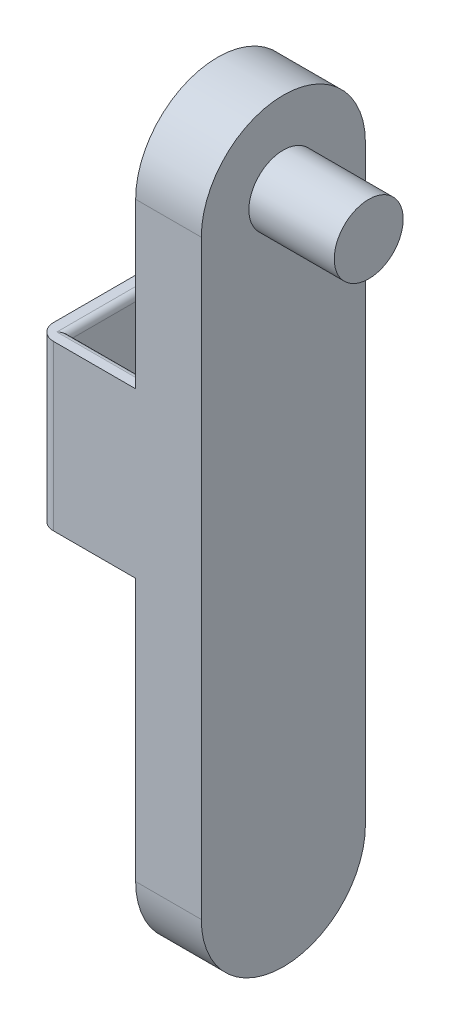
ISO-10303-21;
HEADER;
FILE_DESCRIPTION(('STEP AP214'),'2;1');
FILE_NAME('part.step','',(''),(''),'','','');
FILE_SCHEMA(('AUTOMOTIVE_DESIGN { 1 0 10303 214 1 1 1 1 }'));
ENDSEC;
DATA;
#1=APPLICATION_CONTEXT('core data for automotive mechanical design processes');
#2=APPLICATION_PROTOCOL_DEFINITION('international standard','automotive_design',2000,#1);
#3=PRODUCT_CONTEXT('',#1,'mechanical');
#4=PRODUCT('Part','Part','',(#3));
#5=PRODUCT_RELATED_PRODUCT_CATEGORY('part','',(#4));
#6=PRODUCT_DEFINITION_FORMATION('','',#4);
#7=PRODUCT_DEFINITION_CONTEXT('part definition',#1,'design');
#8=PRODUCT_DEFINITION('design','',#6,#7);
#9=PRODUCT_DEFINITION_SHAPE('','',#8);
#10=(LENGTH_UNIT() NAMED_UNIT(*) SI_UNIT(.MILLI.,.METRE.));
#11=(NAMED_UNIT(*) PLANE_ANGLE_UNIT() SI_UNIT($,.RADIAN.));
#12=(NAMED_UNIT(*) SI_UNIT($,.STERADIAN.) SOLID_ANGLE_UNIT());
#13=UNCERTAINTY_MEASURE_WITH_UNIT(LENGTH_MEASURE(1.E-05),#10,'distance_accuracy_value','');
#14=(GEOMETRIC_REPRESENTATION_CONTEXT(3) GLOBAL_UNCERTAINTY_ASSIGNED_CONTEXT((#13)) GLOBAL_UNIT_ASSIGNED_CONTEXT((#10,
#11,#12)) REPRESENTATION_CONTEXT('',''));
#15=CARTESIAN_POINT('',(0.,0.,0.));
#16=DIRECTION('',(0.,0.,1.));
#17=DIRECTION('',(1.,0.,0.));
#18=AXIS2_PLACEMENT_3D('',#15,#16,#17);
#19=CARTESIAN_POINT('',(0.,15.515536013207,14.7349061395775));
#20=DIRECTION('',(-1.,0.,0.));
#21=DIRECTION('',(0.,0.,1.));
#22=AXIS2_PLACEMENT_3D('',#19,#20,#21);
#23=PLANE('',#22);
#24=DIRECTION('',(0.,-1.,0.));
#25=VECTOR('',#24,1.);
#26=CARTESIAN_POINT('',(0.,15.515536013207,17.2349061395775));
#27=LINE('',#26,#25);
#28=CARTESIAN_POINT('',(0.,5.51553601320701,17.2349061395775));
#29=VERTEX_POINT('',#28);
#30=CARTESIAN_POINT('',(0.,-2.48446398679299,17.2349061395775));
#31=VERTEX_POINT('',#30);
#32=EDGE_CURVE('E222',#29,#31,#27,.T.);
#33=ORIENTED_EDGE('',*,*,#32,.F.);
#34=DIRECTION('',(0.,0.,-1.));
#35=VECTOR('',#34,1.);
#36=CARTESIAN_POINT('',(0.,5.51553601320701,23.0658580344228));
#37=LINE('',#36,#35);
#38=CARTESIAN_POINT('',(0.,5.51553601320701,12.2349061395775));
#39=VERTEX_POINT('',#38);
#40=EDGE_CURVE('E177',#29,#39,#37,.T.);
#41=ORIENTED_EDGE('',*,*,#40,.T.);
#42=DIRECTION('',(0.,1.,0.));
#43=VECTOR('',#42,1.);
#44=CARTESIAN_POINT('',(0.,15.515536013207,12.2349061395775));
#45=LINE('',#44,#43);
#46=CARTESIAN_POINT('',(0.,-2.48446398679299,12.2349061395775));
#47=VERTEX_POINT('',#46);
#48=EDGE_CURVE('E187',#47,#39,#45,.T.);
#49=ORIENTED_EDGE('',*,*,#48,.F.);
#50=CARTESIAN_POINT('',(0.,-2.48446398679299,14.7349061395775));
#51=DIRECTION('',(1.,0.,0.));
#52=DIRECTION('',(0.,0.,1.));
#53=AXIS2_PLACEMENT_3D('',#50,#51,#52);
#54=CIRCLE('',#53,2.5);
#55=EDGE_CURVE('E188',#31,#47,#54,.T.);
#56=ORIENTED_EDGE('',*,*,#55,.F.);
#57=EDGE_LOOP('',(#33,#41,#49,#56));
#58=FACE_BOUND('',#57,.T.);
#59=ADVANCED_FACE('F39',(#58),#23,.T.);
#60=CARTESIAN_POINT('',(2.,15.515536013207,14.7349061395775));
#61=DIRECTION('',(-1.,0.,0.));
#62=DIRECTION('',(0.,0.,1.));
#63=AXIS2_PLACEMENT_3D('',#60,#61,#62);
#64=CYLINDRICAL_SURFACE('',#63,2.5);
#65=CARTESIAN_POINT('',(0.,15.515536013207,14.7349061395775));
#66=DIRECTION('',(1.,0.,0.));
#67=DIRECTION('',(0.,0.,1.));
#68=AXIS2_PLACEMENT_3D('',#65,#66,#67);
#69=CIRCLE('',#68,2.5);
#70=CARTESIAN_POINT('',(0.,15.515536013207,12.2349061395775));
#71=VERTEX_POINT('',#70);
#72=CARTESIAN_POINT('',(0.,15.515536013207,17.2349061395775));
#73=VERTEX_POINT('',#72);
#74=EDGE_CURVE('E186',#71,#73,#69,.T.);
#75=ORIENTED_EDGE('',*,*,#74,.T.);
#76=DIRECTION('',(-1.,0.,0.));
#77=VECTOR('',#76,1.);
#78=CARTESIAN_POINT('',(2.,15.515536013207,17.2349061395775));
#79=LINE('',#78,#77);
#80=CARTESIAN_POINT('',(2.,15.515536013207,17.2349061395775));
#81=VERTEX_POINT('',#80);
#82=EDGE_CURVE('E234',#81,#73,#79,.T.);
#83=ORIENTED_EDGE('',*,*,#82,.F.);
#84=CARTESIAN_POINT('',(2.,15.515536013207,14.7349061395775));
#85=DIRECTION('',(1.,0.,0.));
#86=DIRECTION('',(0.,0.,1.));
#87=AXIS2_PLACEMENT_3D('',#84,#85,#86);
#88=CIRCLE('',#87,2.5);
#89=CARTESIAN_POINT('',(2.,15.515536013207,12.2349061395775));
#90=VERTEX_POINT('',#89);
#91=EDGE_CURVE('E211',#90,#81,#88,.T.);
#92=ORIENTED_EDGE('',*,*,#91,.F.);
#93=DIRECTION('',(-1.,0.,0.));
#94=VECTOR('',#93,1.);
#95=CARTESIAN_POINT('',(2.,15.515536013207,12.2349061395775));
#96=LINE('',#95,#94);
#97=EDGE_CURVE('E220',#90,#71,#96,.T.);
#98=ORIENTED_EDGE('',*,*,#97,.T.);
#99=EDGE_LOOP('',(#75,#83,#92,#98));
#100=FACE_BOUND('',#99,.T.);
#101=ADVANCED_FACE('F360',(#100),#64,.T.);
#102=CARTESIAN_POINT('',(2.,15.515536013207,17.2349061395775));
#103=DIRECTION('',(0.,0.,-1.));
#104=DIRECTION('',(-1.,0.,0.));
#105=AXIS2_PLACEMENT_3D('',#102,#103,#104);
#106=PLANE('',#105);
#107=DIRECTION('',(-1.,0.,0.));
#108=VECTOR('',#107,1.);
#109=CARTESIAN_POINT('',(0.,10.515536013207,17.2349061395775));
#110=LINE('',#109,#108);
#111=CARTESIAN_POINT('',(0.,10.515536013207,17.2349061395775));
#112=VERTEX_POINT('',#111);
#113=CARTESIAN_POINT('',(-2.5,10.515536013207,17.2349061395775));
#114=VERTEX_POINT('',#113);
#115=EDGE_CURVE('E194',#112,#114,#110,.T.);
#116=ORIENTED_EDGE('',*,*,#115,.T.);
#117=DIRECTION('',(0.,-1.,0.));
#118=VECTOR('',#117,1.);
#119=CARTESIAN_POINT('',(-2.5,5.51553601320701,17.2349061395775));
#120=LINE('',#119,#118);
#121=CARTESIAN_POINT('',(-2.5,5.51553601320701,17.2349061395775));
#122=VERTEX_POINT('',#121);
#123=EDGE_CURVE('E240',#114,#122,#120,.T.);
#124=ORIENTED_EDGE('',*,*,#123,.T.);
#125=DIRECTION('',(1.,0.,0.));
#126=VECTOR('',#125,1.);
#127=CARTESIAN_POINT('',(0.,5.51553601320701,17.2349061395775));
#128=LINE('',#127,#126);
#129=EDGE_CURVE('E197',#122,#29,#128,.T.);
#130=ORIENTED_EDGE('',*,*,#129,.T.);
#131=ORIENTED_EDGE('',*,*,#32,.T.);
#132=DIRECTION('',(-1.,0.,0.));
#133=VECTOR('',#132,1.);
#134=CARTESIAN_POINT('',(2.,-2.48446398679299,17.2349061395775));
#135=LINE('',#134,#133);
#136=CARTESIAN_POINT('',(2.,-2.48446398679299,17.2349061395775));
#137=VERTEX_POINT('',#136);
#138=EDGE_CURVE('E231',#137,#31,#135,.T.);
#139=ORIENTED_EDGE('',*,*,#138,.F.);
#140=DIRECTION('',(0.,-1.,0.));
#141=VECTOR('',#140,1.);
#142=CARTESIAN_POINT('',(2.,15.515536013207,17.2349061395775));
#143=LINE('',#142,#141);
#144=EDGE_CURVE('E214',#81,#137,#143,.T.);
#145=ORIENTED_EDGE('',*,*,#144,.F.);
#146=ORIENTED_EDGE('',*,*,#82,.T.);
#147=EDGE_CURVE('E223',#73,#112,#27,.T.);
#148=ORIENTED_EDGE('',*,*,#147,.T.);
#149=EDGE_LOOP('',(#116,#124,#130,#131,#139,#145,#146,#148));
#150=FACE_BOUND('',#149,.T.);
#151=ADVANCED_FACE('F354',(#150),#106,.F.);
#152=CARTESIAN_POINT('',(2.,-2.48446398679299,14.7349061395775));
#153=DIRECTION('',(-1.,0.,0.));
#154=DIRECTION('',(0.,0.,1.));
#155=AXIS2_PLACEMENT_3D('',#152,#153,#154);
#156=CYLINDRICAL_SURFACE('',#155,2.5);
#157=ORIENTED_EDGE('',*,*,#55,.T.);
#158=DIRECTION('',(-1.,0.,0.));
#159=VECTOR('',#158,1.);
#160=CARTESIAN_POINT('',(2.,-2.48446398679299,12.2349061395775));
#161=LINE('',#160,#159);
#162=CARTESIAN_POINT('',(2.,-2.48446398679299,12.2349061395775));
#163=VERTEX_POINT('',#162);
#164=EDGE_CURVE('E228',#163,#47,#161,.T.);
#165=ORIENTED_EDGE('',*,*,#164,.F.);
#166=CARTESIAN_POINT('',(2.,-2.48446398679299,14.7349061395775));
#167=DIRECTION('',(1.,0.,0.));
#168=DIRECTION('',(0.,0.,1.));
#169=AXIS2_PLACEMENT_3D('',#166,#167,#168);
#170=CIRCLE('',#169,2.5);
#171=EDGE_CURVE('E216',#137,#163,#170,.T.);
#172=ORIENTED_EDGE('',*,*,#171,.F.);
#173=ORIENTED_EDGE('',*,*,#138,.T.);
#174=EDGE_LOOP('',(#157,#165,#172,#173));
#175=FACE_BOUND('',#174,.T.);
#176=ADVANCED_FACE('F367',(#175),#156,.T.);
#177=CARTESIAN_POINT('',(2.,15.515536013207,12.2349061395775));
#178=DIRECTION('',(0.,0.,1.));
#179=DIRECTION('',(0.,-1.,0.));
#180=AXIS2_PLACEMENT_3D('',#177,#178,#179);
#181=PLANE('',#180);
#182=DIRECTION('',(-1.,0.,0.));
#183=VECTOR('',#182,1.);
#184=CARTESIAN_POINT('',(0.,5.51553601320701,12.2349061395775));
#185=LINE('',#184,#183);
#186=CARTESIAN_POINT('',(-2.5,5.51553601320701,12.2349061395775));
#187=VERTEX_POINT('',#186);
#188=EDGE_CURVE('E178',#39,#187,#185,.T.);
#189=ORIENTED_EDGE('',*,*,#188,.T.);
#190=DIRECTION('',(0.,1.,0.));
#191=VECTOR('',#190,1.);
#192=CARTESIAN_POINT('',(-2.5,10.515536013207,12.2349061395775));
#193=LINE('',#192,#191);
#194=CARTESIAN_POINT('',(-2.5,10.515536013207,12.2349061395775));
#195=VERTEX_POINT('',#194);
#196=EDGE_CURVE('E174',#187,#195,#193,.T.);
#197=ORIENTED_EDGE('',*,*,#196,.T.);
#198=DIRECTION('',(1.,0.,0.));
#199=VECTOR('',#198,1.);
#200=CARTESIAN_POINT('',(0.,10.515536013207,12.2349061395775));
#201=LINE('',#200,#199);
#202=CARTESIAN_POINT('',(0.,10.515536013207,12.2349061395775));
#203=VERTEX_POINT('',#202);
#204=EDGE_CURVE('E166',#195,#203,#201,.T.);
#205=ORIENTED_EDGE('',*,*,#204,.T.);
#206=EDGE_CURVE('E171',#203,#71,#45,.T.);
#207=ORIENTED_EDGE('',*,*,#206,.T.);
#208=ORIENTED_EDGE('',*,*,#97,.F.);
#209=DIRECTION('',(0.,1.,0.));
#210=VECTOR('',#209,1.);
#211=CARTESIAN_POINT('',(2.,15.515536013207,12.2349061395775));
#212=LINE('',#211,#210);
#213=EDGE_CURVE('E218',#163,#90,#212,.T.);
#214=ORIENTED_EDGE('',*,*,#213,.F.);
#215=ORIENTED_EDGE('',*,*,#164,.T.);
#216=ORIENTED_EDGE('',*,*,#48,.T.);
#217=EDGE_LOOP('',(#189,#197,#205,#207,#208,#214,#215,#216));
#218=FACE_BOUND('',#217,.T.);
#219=ADVANCED_FACE('F169',(#218),#181,.F.);
#220=CARTESIAN_POINT('',(2.,15.515536013207,14.7349061395775));
#221=DIRECTION('',(-1.,0.,0.));
#222=DIRECTION('',(0.,0.,1.));
#223=AXIS2_PLACEMENT_3D('',#220,#221,#222);
#224=PLANE('',#223);
#225=CARTESIAN_POINT('',(2.,15.515536013207,14.7349061395775));
#226=DIRECTION('',(-1.,0.,0.));
#227=DIRECTION('',(0.,0.,1.));
#228=AXIS2_PLACEMENT_3D('',#225,#226,#227);
#229=CIRCLE('',#228,1.05);
#230=CARTESIAN_POINT('',(2.,15.515536013207,15.7849061395775));
#231=VERTEX_POINT('',#230);
#232=EDGE_CURVE('E237',#231,#231,#229,.F.);
#233=ORIENTED_EDGE('',*,*,#232,.F.);
#234=EDGE_LOOP('',(#233));
#235=FACE_BOUND('',#234,.T.);
#236=ORIENTED_EDGE('',*,*,#91,.T.);
#237=ORIENTED_EDGE('',*,*,#144,.T.);
#238=ORIENTED_EDGE('',*,*,#171,.T.);
#239=ORIENTED_EDGE('',*,*,#213,.T.);
#240=EDGE_LOOP('',(#236,#237,#238,#239));
#241=FACE_BOUND('',#240,.T.);
#242=ADVANCED_FACE('F364',(#235,#241),#224,.F.);
#243=DIRECTION('',(0.,0.,-1.));
#244=VECTOR('',#243,1.);
#245=CARTESIAN_POINT('',(0.,10.515536013207,23.0658580344228));
#246=LINE('',#245,#244);
#247=EDGE_CURVE('E183',#112,#203,#246,.T.);
#248=ORIENTED_EDGE('',*,*,#247,.F.);
#249=ORIENTED_EDGE('',*,*,#147,.F.);
#250=ORIENTED_EDGE('',*,*,#74,.F.);
#251=ORIENTED_EDGE('',*,*,#206,.F.);
#252=EDGE_LOOP('',(#248,#249,#250,#251));
#253=FACE_BOUND('',#252,.T.);
#254=ADVANCED_FACE('F182',(#253),#23,.T.);
#255=CARTESIAN_POINT('',(4.6,15.515536013207,14.7349061395775));
#256=DIRECTION('',(-1.,0.,0.));
#257=DIRECTION('',(0.,0.,1.));
#258=AXIS2_PLACEMENT_3D('',#255,#256,#257);
#259=CYLINDRICAL_SURFACE('',#258,1.05);
#260=CARTESIAN_POINT('',(4.6,15.515536013207,14.7349061395775));
#261=DIRECTION('',(1.,0.,0.));
#262=DIRECTION('',(0.,0.,-1.));
#263=AXIS2_PLACEMENT_3D('',#260,#261,#262);
#264=CIRCLE('',#263,1.05);
#265=CARTESIAN_POINT('',(4.6,15.515536013207,13.6849061395775));
#266=VERTEX_POINT('',#265);
#267=EDGE_CURVE('E208',#266,#266,#264,.T.);
#268=ORIENTED_EDGE('',*,*,#267,.F.);
#269=EDGE_LOOP('',(#268));
#270=FACE_BOUND('',#269,.T.);
#271=ORIENTED_EDGE('',*,*,#232,.T.);
#272=EDGE_LOOP('',(#271));
#273=FACE_BOUND('',#272,.T.);
#274=ADVANCED_FACE('F393',(#270,#273),#259,.T.);
#275=CARTESIAN_POINT('',(4.6,15.515536013207,14.7349061395775));
#276=DIRECTION('',(1.,0.,0.));
#277=DIRECTION('',(0.,0.,-1.));
#278=AXIS2_PLACEMENT_3D('',#275,#276,#277);
#279=PLANE('',#278);
#280=ORIENTED_EDGE('',*,*,#267,.T.);
#281=EDGE_LOOP('',(#280));
#282=FACE_BOUND('',#281,.T.);
#283=ADVANCED_FACE('F398',(#282),#279,.T.);
#284=CARTESIAN_POINT('',(0.,10.515536013207,23.0658580344228));
#285=DIRECTION('',(0.,1.,0.));
#286=DIRECTION('',(0.,0.,1.));
#287=AXIS2_PLACEMENT_3D('',#284,#285,#286);
#288=PLANE('',#287);
#289=DIRECTION('',(1.,0.,0.));
#290=VECTOR('',#289,1.);
#291=CARTESIAN_POINT('',(-2.5,10.515536013207,16.9349061395775));
#292=LINE('',#291,#290);
#293=CARTESIAN_POINT('',(-0.3,10.515536013207,16.9349061395775));
#294=VERTEX_POINT('',#293);
#295=CARTESIAN_POINT('',(-2.7,10.515536013207,16.9349061395775));
#296=VERTEX_POINT('',#295);
#297=EDGE_CURVE('E48',#294,#296,#292,.F.);
#298=ORIENTED_EDGE('',*,*,#297,.T.);
#299=DIRECTION('',(0.,0.,1.));
#300=VECTOR('',#299,1.);
#301=CARTESIAN_POINT('',(-2.7,10.515536013207,12.7349061395775));
#302=LINE('',#301,#300);
#303=CARTESIAN_POINT('',(-2.7,10.515536013207,12.5349061395775));
#304=VERTEX_POINT('',#303);
#305=EDGE_CURVE('E11',#296,#304,#302,.F.);
#306=ORIENTED_EDGE('',*,*,#305,.T.);
#307=DIRECTION('',(-1.,0.,0.));
#308=VECTOR('',#307,1.);
#309=CARTESIAN_POINT('',(-0.5,10.515536013207,12.5349061395775));
#310=LINE('',#309,#308);
#311=CARTESIAN_POINT('',(-0.3,10.515536013207,12.5349061395775));
#312=VERTEX_POINT('',#311);
#313=EDGE_CURVE('E285',#304,#312,#310,.F.);
#314=ORIENTED_EDGE('',*,*,#313,.T.);
#315=DIRECTION('',(0.,0.,-1.));
#316=VECTOR('',#315,1.);
#317=CARTESIAN_POINT('',(-0.3,10.515536013207,16.7349061395775));
#318=LINE('',#317,#316);
#319=EDGE_CURVE('E283',#312,#294,#318,.F.);
#320=ORIENTED_EDGE('',*,*,#319,.T.);
#321=EDGE_LOOP('',(#298,#306,#314,#320));
#322=FACE_BOUND('',#321,.T.);
#323=DIRECTION('',(0.,0.,-1.));
#324=VECTOR('',#323,1.);
#325=CARTESIAN_POINT('',(-3.,10.515536013207,23.0658580344228));
#326=LINE('',#325,#324);
#327=CARTESIAN_POINT('',(-3.,10.515536013207,16.7349061395775));
#328=VERTEX_POINT('',#327);
#329=CARTESIAN_POINT('',(-3.,10.515536013207,12.7349061395775));
#330=VERTEX_POINT('',#329);
#331=EDGE_CURVE('E195',#328,#330,#326,.T.);
#332=ORIENTED_EDGE('',*,*,#331,.F.);
#333=CARTESIAN_POINT('',(-2.5,10.515536013207,16.7349061395775));
#334=DIRECTION('',(0.,1.,0.));
#335=DIRECTION('',(0.,0.,1.));
#336=AXIS2_PLACEMENT_3D('',#333,#334,#335);
#337=CIRCLE('',#336,0.5);
#338=EDGE_CURVE('E253',#328,#114,#337,.T.);
#339=ORIENTED_EDGE('',*,*,#338,.T.);
#340=ORIENTED_EDGE('',*,*,#115,.F.);
#341=ORIENTED_EDGE('',*,*,#247,.T.);
#342=ORIENTED_EDGE('',*,*,#204,.F.);
#343=CARTESIAN_POINT('',(-2.5,10.515536013207,12.7349061395775));
#344=DIRECTION('',(0.,1.,0.));
#345=DIRECTION('',(0.,0.,1.));
#346=AXIS2_PLACEMENT_3D('',#343,#344,#345);
#347=CIRCLE('',#346,0.5);
#348=EDGE_CURVE('E251',#195,#330,#347,.T.);
#349=ORIENTED_EDGE('',*,*,#348,.T.);
#350=EDGE_LOOP('',(#332,#339,#340,#341,#342,#349));
#351=FACE_BOUND('',#350,.T.);
#352=ADVANCED_FACE('F192',(#322,#351),#288,.T.);
#353=CARTESIAN_POINT('',(-3.,10.515536013207,23.0658580344228));
#354=DIRECTION('',(-1.,0.,0.));
#355=DIRECTION('',(0.,0.,1.));
#356=AXIS2_PLACEMENT_3D('',#353,#354,#355);
#357=PLANE('',#356);
#358=DIRECTION('',(0.,0.,-1.));
#359=VECTOR('',#358,1.);
#360=CARTESIAN_POINT('',(-3.,5.51553601320701,23.0658580344228));
#361=LINE('',#360,#359);
#362=CARTESIAN_POINT('',(-3.,5.51553601320701,16.7349061395775));
#363=VERTEX_POINT('',#362);
#364=CARTESIAN_POINT('',(-3.,5.51553601320701,12.7349061395775));
#365=VERTEX_POINT('',#364);
#366=EDGE_CURVE('E200',#363,#365,#361,.T.);
#367=ORIENTED_EDGE('',*,*,#366,.F.);
#368=DIRECTION('',(0.,-1.,0.));
#369=VECTOR('',#368,1.);
#370=CARTESIAN_POINT('',(-3.,10.515536013207,16.7349061395775));
#371=LINE('',#370,#369);
#372=EDGE_CURVE('E249',#363,#328,#371,.F.);
#373=ORIENTED_EDGE('',*,*,#372,.T.);
#374=ORIENTED_EDGE('',*,*,#331,.T.);
#375=DIRECTION('',(0.,1.,0.));
#376=VECTOR('',#375,1.);
#377=CARTESIAN_POINT('',(-3.,5.51553601320701,12.7349061395775));
#378=LINE('',#377,#376);
#379=EDGE_CURVE('E247',#330,#365,#378,.F.);
#380=ORIENTED_EDGE('',*,*,#379,.T.);
#381=EDGE_LOOP('',(#367,#373,#374,#380));
#382=FACE_BOUND('',#381,.T.);
#383=ADVANCED_FACE('F348',(#382),#357,.T.);
#384=CARTESIAN_POINT('',(0.,5.51553601320701,23.0658580344228));
#385=DIRECTION('',(0.,-1.,0.));
#386=DIRECTION('',(0.,0.,-1.));
#387=AXIS2_PLACEMENT_3D('',#384,#385,#386);
#388=PLANE('',#387);
#389=DIRECTION('',(0.,0.,1.));
#390=VECTOR('',#389,1.);
#391=CARTESIAN_POINT('',(-0.3,5.51553601320701,12.7349061395775));
#392=LINE('',#391,#390);
#393=CARTESIAN_POINT('',(-0.3,5.51553601320701,16.9349061395775));
#394=VERTEX_POINT('',#393);
#395=CARTESIAN_POINT('',(-0.3,5.51553601320701,12.5349061395775));
#396=VERTEX_POINT('',#395);
#397=EDGE_CURVE('E261',#394,#396,#392,.F.);
#398=ORIENTED_EDGE('',*,*,#397,.T.);
#399=DIRECTION('',(1.,0.,0.));
#400=VECTOR('',#399,1.);
#401=CARTESIAN_POINT('',(-2.5,5.51553601320701,12.5349061395775));
#402=LINE('',#401,#400);
#403=CARTESIAN_POINT('',(-2.7,5.51553601320701,12.5349061395775));
#404=VERTEX_POINT('',#403);
#405=EDGE_CURVE('E267',#396,#404,#402,.F.);
#406=ORIENTED_EDGE('',*,*,#405,.T.);
#407=DIRECTION('',(0.,0.,-1.));
#408=VECTOR('',#407,1.);
#409=CARTESIAN_POINT('',(-2.7,5.51553601320701,16.7349061395775));
#410=LINE('',#409,#408);
#411=CARTESIAN_POINT('',(-2.7,5.51553601320701,16.9349061395775));
#412=VERTEX_POINT('',#411);
#413=EDGE_CURVE('E265',#404,#412,#410,.F.);
#414=ORIENTED_EDGE('',*,*,#413,.T.);
#415=DIRECTION('',(-1.,0.,0.));
#416=VECTOR('',#415,1.);
#417=CARTESIAN_POINT('',(-0.5,5.51553601320701,16.9349061395775));
#418=LINE('',#417,#416);
#419=EDGE_CURVE('E263',#412,#394,#418,.F.);
#420=ORIENTED_EDGE('',*,*,#419,.T.);
#421=EDGE_LOOP('',(#398,#406,#414,#420));
#422=FACE_BOUND('',#421,.T.);
#423=ORIENTED_EDGE('',*,*,#129,.F.);
#424=CARTESIAN_POINT('',(-2.5,5.51553601320701,16.7349061395775));
#425=DIRECTION('',(0.,-1.,0.));
#426=DIRECTION('',(0.,0.,-1.));
#427=AXIS2_PLACEMENT_3D('',#424,#425,#426);
#428=CIRCLE('',#427,0.5);
#429=EDGE_CURVE('E245',#122,#363,#428,.T.);
#430=ORIENTED_EDGE('',*,*,#429,.T.);
#431=ORIENTED_EDGE('',*,*,#366,.T.);
#432=CARTESIAN_POINT('',(-2.5,5.51553601320702,12.7349061395775));
#433=DIRECTION('',(0.,-1.,0.));
#434=DIRECTION('',(0.,0.,-1.));
#435=AXIS2_PLACEMENT_3D('',#432,#433,#434);
#436=CIRCLE('',#435,0.5);
#437=EDGE_CURVE('E243',#365,#187,#436,.T.);
#438=ORIENTED_EDGE('',*,*,#437,.T.);
#439=ORIENTED_EDGE('',*,*,#188,.F.);
#440=ORIENTED_EDGE('',*,*,#40,.F.);
#441=EDGE_LOOP('',(#423,#430,#431,#438,#439,#440));
#442=FACE_BOUND('',#441,.T.);
#443=ADVANCED_FACE('F371',(#422,#442),#388,.T.);
#444=CARTESIAN_POINT('',(-0.5,-4.98446398679299,16.7349061395775));
#445=DIRECTION('',(1.,0.,0.));
#446=DIRECTION('',(0.,0.,-1.));
#447=AXIS2_PLACEMENT_3D('',#444,#445,#446);
#448=PLANE('',#447);
#449=DIRECTION('',(0.,1.,0.));
#450=VECTOR('',#449,1.);
#451=CARTESIAN_POINT('',(-0.5,-4.98446398679299,12.7349061395775));
#452=LINE('',#451,#450);
#453=CARTESIAN_POINT('',(-0.5,5.71553601320701,12.7349061395775));
#454=VERTEX_POINT('',#453);
#455=CARTESIAN_POINT('',(-0.5,10.315536013207,12.7349061395775));
#456=VERTEX_POINT('',#455);
#457=EDGE_CURVE('E298',#454,#456,#452,.T.);
#458=ORIENTED_EDGE('',*,*,#457,.F.);
#459=DIRECTION('',(0.,0.,1.));
#460=VECTOR('',#459,1.);
#461=CARTESIAN_POINT('',(-0.5,5.71553601320701,16.7349061395775));
#462=LINE('',#461,#460);
#463=CARTESIAN_POINT('',(-0.5,5.71553601320701,16.7349061395775));
#464=VERTEX_POINT('',#463);
#465=EDGE_CURVE('E281',#454,#464,#462,.T.);
#466=ORIENTED_EDGE('',*,*,#465,.T.);
#467=DIRECTION('',(0.,1.,0.));
#468=VECTOR('',#467,1.);
#469=CARTESIAN_POINT('',(-0.5,-4.98446398679299,16.7349061395775));
#470=LINE('',#469,#468);
#471=CARTESIAN_POINT('',(-0.5,10.315536013207,16.7349061395775));
#472=VERTEX_POINT('',#471);
#473=EDGE_CURVE('E331',#464,#472,#470,.T.);
#474=ORIENTED_EDGE('',*,*,#473,.T.);
#475=DIRECTION('',(0.,0.,-1.));
#476=VECTOR('',#475,1.);
#477=CARTESIAN_POINT('',(-0.5,10.315536013207,12.7349061395775));
#478=LINE('',#477,#476);
#479=EDGE_CURVE('E279',#472,#456,#478,.T.);
#480=ORIENTED_EDGE('',*,*,#479,.T.);
#481=EDGE_LOOP('',(#458,#466,#474,#480));
#482=FACE_BOUND('',#481,.T.);
#483=ADVANCED_FACE('F373',(#482),#448,.F.);
#484=CARTESIAN_POINT('',(-0.5,-4.98446398679299,16.7349061395775));
#485=DIRECTION('',(0.,0.,1.));
#486=DIRECTION('',(0.,-1.,0.));
#487=AXIS2_PLACEMENT_3D('',#484,#485,#486);
#488=PLANE('',#487);
#489=ORIENTED_EDGE('',*,*,#473,.F.);
#490=DIRECTION('',(-1.,0.,0.));
#491=VECTOR('',#490,1.);
#492=CARTESIAN_POINT('',(-2.5,5.71553601320701,16.7349061395775));
#493=LINE('',#492,#491);
#494=CARTESIAN_POINT('',(-2.5,5.71553601320701,16.7349061395775));
#495=VERTEX_POINT('',#494);
#496=EDGE_CURVE('E277',#464,#495,#493,.T.);
#497=ORIENTED_EDGE('',*,*,#496,.T.);
#498=DIRECTION('',(0.,1.,0.));
#499=VECTOR('',#498,1.);
#500=CARTESIAN_POINT('',(-2.5,-4.98446398679299,16.7349061395775));
#501=LINE('',#500,#499);
#502=CARTESIAN_POINT('',(-2.5,10.315536013207,16.7349061395775));
#503=VERTEX_POINT('',#502);
#504=EDGE_CURVE('E325',#495,#503,#501,.T.);
#505=ORIENTED_EDGE('',*,*,#504,.T.);
#506=DIRECTION('',(1.,0.,0.));
#507=VECTOR('',#506,1.);
#508=CARTESIAN_POINT('',(-0.5,10.315536013207,16.7349061395775));
#509=LINE('',#508,#507);
#510=EDGE_CURVE('E275',#503,#472,#509,.T.);
#511=ORIENTED_EDGE('',*,*,#510,.T.);
#512=EDGE_LOOP('',(#489,#497,#505,#511));
#513=FACE_BOUND('',#512,.T.);
#514=ADVANCED_FACE('F329',(#513),#488,.F.);
#515=CARTESIAN_POINT('',(-2.5,-4.98446398679299,16.7349061395775));
#516=DIRECTION('',(-1.,0.,0.));
#517=DIRECTION('',(0.,0.,1.));
#518=AXIS2_PLACEMENT_3D('',#515,#516,#517);
#519=PLANE('',#518);
#520=ORIENTED_EDGE('',*,*,#504,.F.);
#521=DIRECTION('',(0.,0.,-1.));
#522=VECTOR('',#521,1.);
#523=CARTESIAN_POINT('',(-2.5,5.71553601320701,12.7349061395775));
#524=LINE('',#523,#522);
#525=CARTESIAN_POINT('',(-2.5,5.71553601320701,12.7349061395775));
#526=VERTEX_POINT('',#525);
#527=EDGE_CURVE('E273',#495,#526,#524,.T.);
#528=ORIENTED_EDGE('',*,*,#527,.T.);
#529=DIRECTION('',(0.,1.,0.));
#530=VECTOR('',#529,1.);
#531=CARTESIAN_POINT('',(-2.5,-4.98446398679299,12.7349061395775));
#532=LINE('',#531,#530);
#533=CARTESIAN_POINT('',(-2.5,10.315536013207,12.7349061395775));
#534=VERTEX_POINT('',#533);
#535=EDGE_CURVE('E328',#526,#534,#532,.T.);
#536=ORIENTED_EDGE('',*,*,#535,.T.);
#537=DIRECTION('',(0.,0.,1.));
#538=VECTOR('',#537,1.);
#539=CARTESIAN_POINT('',(-2.5,10.315536013207,16.7349061395775));
#540=LINE('',#539,#538);
#541=EDGE_CURVE('E270',#534,#503,#540,.T.);
#542=ORIENTED_EDGE('',*,*,#541,.T.);
#543=EDGE_LOOP('',(#520,#528,#536,#542));
#544=FACE_BOUND('',#543,.T.);
#545=ADVANCED_FACE('F324',(#544),#519,.F.);
#546=CARTESIAN_POINT('',(-0.5,-4.98446398679299,12.7349061395775));
#547=DIRECTION('',(0.,0.,-1.));
#548=DIRECTION('',(0.,1.,0.));
#549=AXIS2_PLACEMENT_3D('',#546,#547,#548);
#550=PLANE('',#549);
#551=ORIENTED_EDGE('',*,*,#535,.F.);
#552=DIRECTION('',(1.,0.,0.));
#553=VECTOR('',#552,1.);
#554=CARTESIAN_POINT('',(-0.5,5.71553601320701,12.7349061395775));
#555=LINE('',#554,#553);
#556=EDGE_CURVE('E258',#526,#454,#555,.T.);
#557=ORIENTED_EDGE('',*,*,#556,.T.);
#558=ORIENTED_EDGE('',*,*,#457,.T.);
#559=DIRECTION('',(-1.,0.,0.));
#560=VECTOR('',#559,1.);
#561=CARTESIAN_POINT('',(-2.5,10.315536013207,12.7349061395775));
#562=LINE('',#561,#560);
#563=EDGE_CURVE('E256',#456,#534,#562,.T.);
#564=ORIENTED_EDGE('',*,*,#563,.T.);
#565=EDGE_LOOP('',(#551,#557,#558,#564));
#566=FACE_BOUND('',#565,.T.);
#567=ADVANCED_FACE('F417',(#566),#550,.F.);
#568=CARTESIAN_POINT('',(-2.5,15.515536013207,16.7349061395775));
#569=DIRECTION('',(0.,1.,0.));
#570=DIRECTION('',(0.,0.,1.));
#571=AXIS2_PLACEMENT_3D('',#568,#569,#570);
#572=CYLINDRICAL_SURFACE('',#571,0.5);
#573=ORIENTED_EDGE('',*,*,#338,.F.);
#574=ORIENTED_EDGE('',*,*,#372,.F.);
#575=ORIENTED_EDGE('',*,*,#429,.F.);
#576=ORIENTED_EDGE('',*,*,#123,.F.);
#577=EDGE_LOOP('',(#573,#574,#575,#576));
#578=FACE_BOUND('',#577,.T.);
#579=ADVANCED_FACE('F351',(#578),#572,.T.);
#580=CARTESIAN_POINT('',(-2.5,15.515536013207,12.7349061395775));
#581=DIRECTION('',(0.,-1.,0.));
#582=DIRECTION('',(0.,0.,-1.));
#583=AXIS2_PLACEMENT_3D('',#580,#581,#582);
#584=CYLINDRICAL_SURFACE('',#583,0.5);
#585=ORIENTED_EDGE('',*,*,#437,.F.);
#586=ORIENTED_EDGE('',*,*,#379,.F.);
#587=ORIENTED_EDGE('',*,*,#348,.F.);
#588=ORIENTED_EDGE('',*,*,#196,.F.);
#589=EDGE_LOOP('',(#585,#586,#587,#588));
#590=FACE_BOUND('',#589,.T.);
#591=ADVANCED_FACE('F343',(#590),#584,.T.);
#592=CARTESIAN_POINT('',(-0.5,5.71553601320701,16.9349061395775));
#593=DIRECTION('',(1.,0.,0.));
#594=DIRECTION('',(0.,0.,-1.));
#595=AXIS2_PLACEMENT_3D('',#592,#593,#594);
#596=CYLINDRICAL_SURFACE('',#595,0.2);
#597=CARTESIAN_POINT('',(-0.3,5.71553601320701,16.9349061395775));
#598=DIRECTION('',(0.707106781186547,0.,-0.707106781186547));
#599=DIRECTION('',(0.707106781186547,0.,0.707106781186547));
#600=AXIS2_PLACEMENT_3D('',#597,#598,#599);
#601=ELLIPSE('',#600,0.282842712474619,0.2);
#602=EDGE_CURVE('E292',#394,#464,#601,.T.);
#603=ORIENTED_EDGE('',*,*,#602,.F.);
#604=ORIENTED_EDGE('',*,*,#419,.F.);
#605=CARTESIAN_POINT('',(-2.7,5.71553601320701,16.9349061395775));
#606=DIRECTION('',(0.707106781186547,0.,0.707106781186547));
#607=DIRECTION('',(-0.707106781186547,0.,0.707106781186547));
#608=AXIS2_PLACEMENT_3D('',#605,#606,#607);
#609=ELLIPSE('',#608,0.282842712474619,0.2);
#610=EDGE_CURVE('E295',#495,#412,#609,.F.);
#611=ORIENTED_EDGE('',*,*,#610,.F.);
#612=ORIENTED_EDGE('',*,*,#496,.F.);
#613=EDGE_LOOP('',(#603,#604,#611,#612));
#614=FACE_BOUND('',#613,.T.);
#615=ADVANCED_FACE('F450',(#614),#596,.T.);
#616=CARTESIAN_POINT('',(-2.7,5.71553601320701,16.7349061395775));
#617=DIRECTION('',(0.,0.,1.));
#618=DIRECTION('',(0.,-1.,0.));
#619=AXIS2_PLACEMENT_3D('',#616,#617,#618);
#620=CYLINDRICAL_SURFACE('',#619,0.2);
#621=ORIENTED_EDGE('',*,*,#610,.T.);
#622=ORIENTED_EDGE('',*,*,#413,.F.);
#623=CARTESIAN_POINT('',(-2.7,5.71553601320701,12.5349061395775));
#624=DIRECTION('',(-0.707106781186547,0.,0.707106781186547));
#625=DIRECTION('',(-0.707106781186547,0.,-0.707106781186547));
#626=AXIS2_PLACEMENT_3D('',#623,#624,#625);
#627=ELLIPSE('',#626,0.282842712474619,0.2);
#628=EDGE_CURVE('E290',#526,#404,#627,.F.);
#629=ORIENTED_EDGE('',*,*,#628,.F.);
#630=ORIENTED_EDGE('',*,*,#527,.F.);
#631=EDGE_LOOP('',(#621,#622,#629,#630));
#632=FACE_BOUND('',#631,.T.);
#633=ADVANCED_FACE('F456',(#632),#620,.T.);
#634=CARTESIAN_POINT('',(-0.3,5.71553601320701,16.7349061395775));
#635=DIRECTION('',(0.,0.,-1.));
#636=DIRECTION('',(0.,1.,0.));
#637=AXIS2_PLACEMENT_3D('',#634,#635,#636);
#638=CYLINDRICAL_SURFACE('',#637,0.2);
#639=ORIENTED_EDGE('',*,*,#602,.T.);
#640=ORIENTED_EDGE('',*,*,#465,.F.);
#641=CARTESIAN_POINT('',(-0.3,5.71553601320701,12.5349061395775));
#642=DIRECTION('',(-0.707106781186547,0.,-0.707106781186547));
#643=DIRECTION('',(-0.707106781186547,0.,0.707106781186547));
#644=AXIS2_PLACEMENT_3D('',#641,#642,#643);
#645=ELLIPSE('',#644,0.282842712474619,0.2);
#646=EDGE_CURVE('E288',#396,#454,#645,.T.);
#647=ORIENTED_EDGE('',*,*,#646,.F.);
#648=ORIENTED_EDGE('',*,*,#397,.F.);
#649=EDGE_LOOP('',(#639,#640,#647,#648));
#650=FACE_BOUND('',#649,.T.);
#651=ADVANCED_FACE('F464',(#650),#638,.T.);
#652=CARTESIAN_POINT('',(-0.5,5.71553601320701,12.5349061395775));
#653=DIRECTION('',(-1.,0.,0.));
#654=DIRECTION('',(0.,0.,1.));
#655=AXIS2_PLACEMENT_3D('',#652,#653,#654);
#656=CYLINDRICAL_SURFACE('',#655,0.2);
#657=ORIENTED_EDGE('',*,*,#628,.T.);
#658=ORIENTED_EDGE('',*,*,#405,.F.);
#659=ORIENTED_EDGE('',*,*,#646,.T.);
#660=ORIENTED_EDGE('',*,*,#556,.F.);
#661=EDGE_LOOP('',(#657,#658,#659,#660));
#662=FACE_BOUND('',#661,.T.);
#663=ADVANCED_FACE('F472',(#662),#656,.T.);
#664=CARTESIAN_POINT('',(-0.3,10.315536013207,16.7349061395775));
#665=DIRECTION('',(0.,0.,1.));
#666=DIRECTION('',(0.,-1.,0.));
#667=AXIS2_PLACEMENT_3D('',#664,#665,#666);
#668=CYLINDRICAL_SURFACE('',#667,0.2);
#669=CARTESIAN_POINT('',(-0.3,10.315536013207,16.9349061395775));
#670=DIRECTION('',(-0.707106781186547,0.,0.707106781186547));
#671=DIRECTION('',(-0.707106781186547,0.,-0.707106781186547));
#672=AXIS2_PLACEMENT_3D('',#669,#670,#671);
#673=ELLIPSE('',#672,0.282842712474619,0.2);
#674=EDGE_CURVE('E301',#294,#472,#673,.T.);
#675=ORIENTED_EDGE('',*,*,#674,.F.);
#676=ORIENTED_EDGE('',*,*,#319,.F.);
#677=CARTESIAN_POINT('',(-0.3,10.315536013207,12.5349061395775));
#678=DIRECTION('',(0.707106781186547,0.,0.707106781186547));
#679=DIRECTION('',(0.707106781186547,0.,-0.707106781186547));
#680=AXIS2_PLACEMENT_3D('',#677,#678,#679);
#681=ELLIPSE('',#680,0.282842712474619,0.2);
#682=EDGE_CURVE('E43',#456,#312,#681,.F.);
#683=ORIENTED_EDGE('',*,*,#682,.F.);
#684=ORIENTED_EDGE('',*,*,#479,.F.);
#685=EDGE_LOOP('',(#675,#676,#683,#684));
#686=FACE_BOUND('',#685,.T.);
#687=ADVANCED_FACE('F41',(#686),#668,.T.);
#688=CARTESIAN_POINT('',(-0.5,10.315536013207,12.5349061395775));
#689=DIRECTION('',(1.,0.,0.));
#690=DIRECTION('',(0.,0.,-1.));
#691=AXIS2_PLACEMENT_3D('',#688,#689,#690);
#692=CYLINDRICAL_SURFACE('',#691,0.2);
#693=ORIENTED_EDGE('',*,*,#682,.T.);
#694=ORIENTED_EDGE('',*,*,#313,.F.);
#695=CARTESIAN_POINT('',(-2.7,10.315536013207,12.5349061395775));
#696=DIRECTION('',(0.707106781186547,0.,-0.707106781186547));
#697=DIRECTION('',(-0.707106781186547,0.,-0.707106781186547));
#698=AXIS2_PLACEMENT_3D('',#695,#696,#697);
#699=ELLIPSE('',#698,0.282842712474619,0.2);
#700=EDGE_CURVE('E61',#534,#304,#699,.F.);
#701=ORIENTED_EDGE('',*,*,#700,.F.);
#702=ORIENTED_EDGE('',*,*,#563,.F.);
#703=EDGE_LOOP('',(#693,#694,#701,#702));
#704=FACE_BOUND('',#703,.T.);
#705=ADVANCED_FACE('F310',(#704),#692,.T.);
#706=CARTESIAN_POINT('',(-0.5,10.315536013207,16.9349061395775));
#707=DIRECTION('',(-1.,0.,0.));
#708=DIRECTION('',(0.,0.,1.));
#709=AXIS2_PLACEMENT_3D('',#706,#707,#708);
#710=CYLINDRICAL_SURFACE('',#709,0.2);
#711=ORIENTED_EDGE('',*,*,#674,.T.);
#712=ORIENTED_EDGE('',*,*,#510,.F.);
#713=CARTESIAN_POINT('',(-2.7,10.315536013207,16.9349061395775));
#714=DIRECTION('',(-0.707106781186547,0.,-0.707106781186547));
#715=DIRECTION('',(0.707106781186547,0.,-0.707106781186547));
#716=AXIS2_PLACEMENT_3D('',#713,#714,#715);
#717=ELLIPSE('',#716,0.282842712474619,0.2);
#718=EDGE_CURVE('E299',#296,#503,#717,.T.);
#719=ORIENTED_EDGE('',*,*,#718,.F.);
#720=ORIENTED_EDGE('',*,*,#297,.F.);
#721=EDGE_LOOP('',(#711,#712,#719,#720));
#722=FACE_BOUND('',#721,.T.);
#723=ADVANCED_FACE('F316',(#722),#710,.T.);
#724=CARTESIAN_POINT('',(-2.7,10.315536013207,16.7349061395775));
#725=DIRECTION('',(0.,0.,-1.));
#726=DIRECTION('',(0.,1.,0.));
#727=AXIS2_PLACEMENT_3D('',#724,#725,#726);
#728=CYLINDRICAL_SURFACE('',#727,0.2);
#729=ORIENTED_EDGE('',*,*,#700,.T.);
#730=ORIENTED_EDGE('',*,*,#305,.F.);
#731=ORIENTED_EDGE('',*,*,#718,.T.);
#732=ORIENTED_EDGE('',*,*,#541,.F.);
#733=EDGE_LOOP('',(#729,#730,#731,#732));
#734=FACE_BOUND('',#733,.T.);
#735=ADVANCED_FACE('F315',(#734),#728,.T.);
#736=CLOSED_SHELL('',(#59,#101,#151,#176,#219,#242,#254,#274,#283,#352,#383,#443,#483,#514,#545,
#567,#579,#591,#615,#633,#651,#663,#687,#705,#723,#735));
#737=MANIFOLD_SOLID_BREP('B2',#736);
#738=ADVANCED_BREP_SHAPE_REPRESENTATION('',(#18,#737),#14);
#739=SHAPE_DEFINITION_REPRESENTATION(#9,#738);
ENDSEC;
END-ISO-10303-21;
